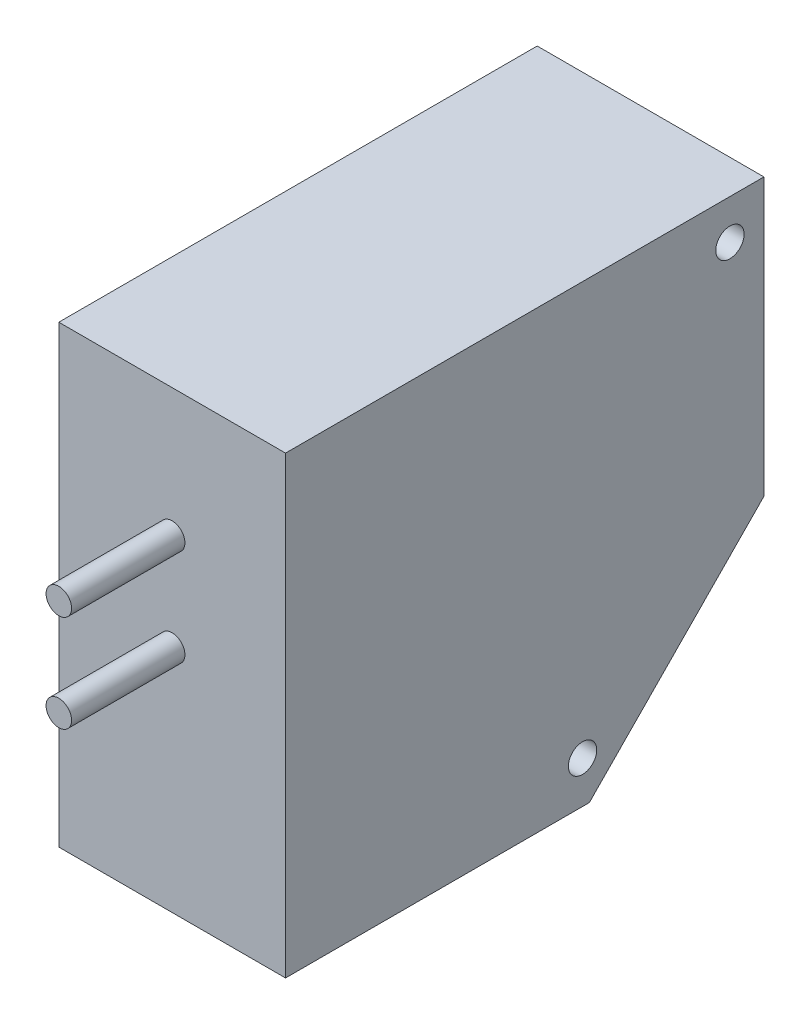
ISO-10303-21;
HEADER;
FILE_DESCRIPTION(('STEP AP214'),'2;1');
FILE_NAME('part.step','',(''),(''),'','','');
FILE_SCHEMA(('AUTOMOTIVE_DESIGN { 1 0 10303 214 1 1 1 1 }'));
ENDSEC;
DATA;
#1=APPLICATION_CONTEXT('core data for automotive mechanical design processes');
#2=APPLICATION_PROTOCOL_DEFINITION('international standard','automotive_design',2000,#1);
#3=PRODUCT_CONTEXT('',#1,'mechanical');
#4=PRODUCT('Part','Part','',(#3));
#5=PRODUCT_RELATED_PRODUCT_CATEGORY('part','',(#4));
#6=PRODUCT_DEFINITION_FORMATION('','',#4);
#7=PRODUCT_DEFINITION_CONTEXT('part definition',#1,'design');
#8=PRODUCT_DEFINITION('design','',#6,#7);
#9=PRODUCT_DEFINITION_SHAPE('','',#8);
#10=(LENGTH_UNIT() NAMED_UNIT(*) SI_UNIT(.MILLI.,.METRE.));
#11=(NAMED_UNIT(*) PLANE_ANGLE_UNIT() SI_UNIT($,.RADIAN.));
#12=(NAMED_UNIT(*) SI_UNIT($,.STERADIAN.) SOLID_ANGLE_UNIT());
#13=UNCERTAINTY_MEASURE_WITH_UNIT(LENGTH_MEASURE(1.E-05),#10,'distance_accuracy_value','');
#14=(GEOMETRIC_REPRESENTATION_CONTEXT(3) GLOBAL_UNCERTAINTY_ASSIGNED_CONTEXT((#13)) GLOBAL_UNIT_ASSIGNED_CONTEXT((#10,
#11,#12)) REPRESENTATION_CONTEXT('',''));
#15=CARTESIAN_POINT('',(0.,0.,0.));
#16=DIRECTION('',(0.,0.,1.));
#17=DIRECTION('',(1.,0.,0.));
#18=AXIS2_PLACEMENT_3D('',#15,#16,#17);
#19=CARTESIAN_POINT('',(20.,20.05,21.1));
#20=DIRECTION('',(0.,0.,-1.));
#21=DIRECTION('',(0.,1.,0.));
#22=AXIS2_PLACEMENT_3D('',#19,#20,#21);
#23=PLANE('',#22);
#24=CARTESIAN_POINT('',(10.,8.75000000000001,21.1));
#25=DIRECTION('',(0.,0.,-1.));
#26=DIRECTION('',(0.,1.,0.));
#27=AXIS2_PLACEMENT_3D('',#24,#25,#26);
#28=CIRCLE('',#27,1.125);
#29=CARTESIAN_POINT('',(10.,9.87500000000001,21.1));
#30=VERTEX_POINT('',#29);
#31=EDGE_CURVE('E41',#30,#30,#28,.F.);
#32=ORIENTED_EDGE('',*,*,#31,.F.);
#33=EDGE_LOOP('',(#32));
#34=FACE_BOUND('',#33,.T.);
#35=DIRECTION('',(0.,-1.,0.));
#36=VECTOR('',#35,1.);
#37=CARTESIAN_POINT('',(0.,20.05,21.1));
#38=LINE('',#37,#36);
#39=CARTESIAN_POINT('',(0.,20.05,21.1));
#40=VERTEX_POINT('',#39);
#41=CARTESIAN_POINT('',(0.,-20.05,21.1));
#42=VERTEX_POINT('',#41);
#43=EDGE_CURVE('E109',#40,#42,#38,.T.);
#44=ORIENTED_EDGE('',*,*,#43,.T.);
#45=DIRECTION('',(-1.,0.,0.));
#46=VECTOR('',#45,1.);
#47=CARTESIAN_POINT('',(20.,-20.05,21.1));
#48=LINE('',#47,#46);
#49=CARTESIAN_POINT('',(20.,-20.05,21.1));
#50=VERTEX_POINT('',#49);
#51=EDGE_CURVE('E122',#50,#42,#48,.T.);
#52=ORIENTED_EDGE('',*,*,#51,.F.);
#53=DIRECTION('',(0.,-1.,0.));
#54=VECTOR('',#53,1.);
#55=CARTESIAN_POINT('',(20.,20.05,21.1));
#56=LINE('',#55,#54);
#57=CARTESIAN_POINT('',(20.,20.05,21.1));
#58=VERTEX_POINT('',#57);
#59=EDGE_CURVE('E118',#58,#50,#56,.T.);
#60=ORIENTED_EDGE('',*,*,#59,.F.);
#61=DIRECTION('',(-1.,0.,0.));
#62=VECTOR('',#61,1.);
#63=CARTESIAN_POINT('',(20.,20.05,21.1));
#64=LINE('',#63,#62);
#65=EDGE_CURVE('E105',#58,#40,#64,.T.);
#66=ORIENTED_EDGE('',*,*,#65,.T.);
#67=EDGE_LOOP('',(#44,#52,#60,#66));
#68=FACE_BOUND('',#67,.T.);
#69=CARTESIAN_POINT('',(10.,0.200000000000006,21.1));
#70=DIRECTION('',(0.,0.,-1.));
#71=DIRECTION('',(0.,1.,0.));
#72=AXIS2_PLACEMENT_3D('',#69,#70,#71);
#73=CIRCLE('',#72,1.125);
#74=CARTESIAN_POINT('',(10.,1.32500000000001,21.1));
#75=VERTEX_POINT('',#74);
#76=EDGE_CURVE('E11',#75,#75,#73,.F.);
#77=ORIENTED_EDGE('',*,*,#76,.F.);
#78=EDGE_LOOP('',(#77));
#79=FACE_BOUND('',#78,.T.);
#80=ADVANCED_FACE('F33',(#34,#68,#79),#23,.F.);
#81=CARTESIAN_POINT('',(20.,-20.05,21.1));
#82=DIRECTION('',(0.,1.,0.));
#83=DIRECTION('',(0.,0.,1.));
#84=AXIS2_PLACEMENT_3D('',#81,#82,#83);
#85=PLANE('',#84);
#86=DIRECTION('',(0.,0.,-1.));
#87=VECTOR('',#86,1.);
#88=CARTESIAN_POINT('',(0.,-20.05,21.1));
#89=LINE('',#88,#87);
#90=CARTESIAN_POINT('',(0.,-20.05,-5.7));
#91=VERTEX_POINT('',#90);
#92=EDGE_CURVE('E112',#42,#91,#89,.T.);
#93=ORIENTED_EDGE('',*,*,#92,.T.);
#94=DIRECTION('',(-1.,0.,0.));
#95=VECTOR('',#94,1.);
#96=CARTESIAN_POINT('',(20.,-20.05,-5.7));
#97=LINE('',#96,#95);
#98=CARTESIAN_POINT('',(20.,-20.05,-5.7));
#99=VERTEX_POINT('',#98);
#100=EDGE_CURVE('E100',#99,#91,#97,.T.);
#101=ORIENTED_EDGE('',*,*,#100,.F.);
#102=DIRECTION('',(0.,0.,-1.));
#103=VECTOR('',#102,1.);
#104=CARTESIAN_POINT('',(20.,-20.05,21.1));
#105=LINE('',#104,#103);
#106=EDGE_CURVE('E84',#50,#99,#105,.T.);
#107=ORIENTED_EDGE('',*,*,#106,.F.);
#108=ORIENTED_EDGE('',*,*,#51,.T.);
#109=EDGE_LOOP('',(#93,#101,#107,#108));
#110=FACE_BOUND('',#109,.T.);
#111=ADVANCED_FACE('F130',(#110),#85,.F.);
#112=CARTESIAN_POINT('',(20.,-20.05,-5.7));
#113=DIRECTION('',(0.,0.700253236526023,0.713894533341466));
#114=DIRECTION('',(0.,-0.713894533341466,0.700253236526023));
#115=AXIS2_PLACEMENT_3D('',#112,#113,#114);
#116=PLANE('',#115);
#117=DIRECTION('',(0.,0.713894533341466,-0.700253236526023));
#118=VECTOR('',#117,1.);
#119=CARTESIAN_POINT('',(0.,-20.05,-5.7));
#120=LINE('',#119,#118);
#121=CARTESIAN_POINT('',(0.,-4.34999999999999,-21.1));
#122=VERTEX_POINT('',#121);
#123=EDGE_CURVE('E99',#91,#122,#120,.T.);
#124=ORIENTED_EDGE('',*,*,#123,.T.);
#125=DIRECTION('',(-1.,0.,0.));
#126=VECTOR('',#125,1.);
#127=CARTESIAN_POINT('',(20.,-4.34999999999999,-21.1));
#128=LINE('',#127,#126);
#129=CARTESIAN_POINT('',(20.,-4.34999999999999,-21.1));
#130=VERTEX_POINT('',#129);
#131=EDGE_CURVE('E96',#130,#122,#128,.T.);
#132=ORIENTED_EDGE('',*,*,#131,.F.);
#133=DIRECTION('',(0.,0.713894533341466,-0.700253236526023));
#134=VECTOR('',#133,1.);
#135=CARTESIAN_POINT('',(20.,-20.05,-5.7));
#136=LINE('',#135,#134);
#137=EDGE_CURVE('E88',#99,#130,#136,.T.);
#138=ORIENTED_EDGE('',*,*,#137,.F.);
#139=ORIENTED_EDGE('',*,*,#100,.T.);
#140=EDGE_LOOP('',(#124,#132,#138,#139));
#141=FACE_BOUND('',#140,.T.);
#142=ADVANCED_FACE('F97',(#141),#116,.F.);
#143=CARTESIAN_POINT('',(20.,20.05,-21.1));
#144=DIRECTION('',(0.,0.,1.));
#145=DIRECTION('',(1.,0.,0.));
#146=AXIS2_PLACEMENT_3D('',#143,#144,#145);
#147=PLANE('',#146);
#148=DIRECTION('',(0.,1.,0.));
#149=VECTOR('',#148,1.);
#150=CARTESIAN_POINT('',(0.,20.05,-21.1));
#151=LINE('',#150,#149);
#152=CARTESIAN_POINT('',(0.,20.05,-21.1));
#153=VERTEX_POINT('',#152);
#154=EDGE_CURVE('E69',#122,#153,#151,.T.);
#155=ORIENTED_EDGE('',*,*,#154,.T.);
#156=DIRECTION('',(-1.,0.,0.));
#157=VECTOR('',#156,1.);
#158=CARTESIAN_POINT('',(20.,20.05,-21.1));
#159=LINE('',#158,#157);
#160=CARTESIAN_POINT('',(20.,20.05,-21.1));
#161=VERTEX_POINT('',#160);
#162=EDGE_CURVE('E101',#161,#153,#159,.T.);
#163=ORIENTED_EDGE('',*,*,#162,.F.);
#164=DIRECTION('',(0.,1.,0.));
#165=VECTOR('',#164,1.);
#166=CARTESIAN_POINT('',(20.,20.05,-21.1));
#167=LINE('',#166,#165);
#168=EDGE_CURVE('E92',#130,#161,#167,.T.);
#169=ORIENTED_EDGE('',*,*,#168,.F.);
#170=ORIENTED_EDGE('',*,*,#131,.T.);
#171=EDGE_LOOP('',(#155,#163,#169,#170));
#172=FACE_BOUND('',#171,.T.);
#173=ADVANCED_FACE('F103',(#172),#147,.F.);
#174=CARTESIAN_POINT('',(20.,20.05,21.1));
#175=DIRECTION('',(0.,-1.,0.));
#176=DIRECTION('',(0.,0.,-1.));
#177=AXIS2_PLACEMENT_3D('',#174,#175,#176);
#178=PLANE('',#177);
#179=DIRECTION('',(0.,0.,1.));
#180=VECTOR('',#179,1.);
#181=CARTESIAN_POINT('',(0.,20.05,21.1));
#182=LINE('',#181,#180);
#183=EDGE_CURVE('E75',#153,#40,#182,.T.);
#184=ORIENTED_EDGE('',*,*,#183,.T.);
#185=ORIENTED_EDGE('',*,*,#65,.F.);
#186=DIRECTION('',(0.,0.,1.));
#187=VECTOR('',#186,1.);
#188=CARTESIAN_POINT('',(20.,20.05,21.1));
#189=LINE('',#188,#187);
#190=EDGE_CURVE('E49',#161,#58,#189,.T.);
#191=ORIENTED_EDGE('',*,*,#190,.F.);
#192=ORIENTED_EDGE('',*,*,#162,.T.);
#193=EDGE_LOOP('',(#184,#185,#191,#192));
#194=FACE_BOUND('',#193,.T.);
#195=ADVANCED_FACE('F166',(#194),#178,.F.);
#196=CARTESIAN_POINT('',(20.,-20.05,21.1));
#197=DIRECTION('',(1.,0.,0.));
#198=DIRECTION('',(0.,0.,-1.));
#199=AXIS2_PLACEMENT_3D('',#196,#197,#198);
#200=PLANE('',#199);
#201=CARTESIAN_POINT('',(20.,-16.35,-5.09999999999999));
#202=DIRECTION('',(1.,0.,0.));
#203=DIRECTION('',(0.,0.,-1.));
#204=AXIS2_PLACEMENT_3D('',#201,#202,#203);
#205=CIRCLE('',#204,1.24999999999999);
#206=CARTESIAN_POINT('',(20.,-16.35,-6.34999999999998));
#207=VERTEX_POINT('',#206);
#208=EDGE_CURVE('E191',#207,#207,#205,.T.);
#209=ORIENTED_EDGE('',*,*,#208,.F.);
#210=EDGE_LOOP('',(#209));
#211=FACE_BOUND('',#210,.T.);
#212=CARTESIAN_POINT('',(20.,16.55,-18.1));
#213=DIRECTION('',(1.,0.,0.));
#214=DIRECTION('',(0.,0.,-1.));
#215=AXIS2_PLACEMENT_3D('',#212,#213,#214);
#216=CIRCLE('',#215,1.24999999999999);
#217=CARTESIAN_POINT('',(20.,16.55,-19.35));
#218=VERTEX_POINT('',#217);
#219=EDGE_CURVE('E185',#218,#218,#216,.T.);
#220=ORIENTED_EDGE('',*,*,#219,.F.);
#221=EDGE_LOOP('',(#220));
#222=FACE_BOUND('',#221,.T.);
#223=ORIENTED_EDGE('',*,*,#59,.T.);
#224=ORIENTED_EDGE('',*,*,#106,.T.);
#225=ORIENTED_EDGE('',*,*,#137,.T.);
#226=ORIENTED_EDGE('',*,*,#168,.T.);
#227=ORIENTED_EDGE('',*,*,#190,.T.);
#228=EDGE_LOOP('',(#223,#224,#225,#226,#227));
#229=FACE_BOUND('',#228,.T.);
#230=ADVANCED_FACE('F90',(#211,#222,#229),#200,.T.);
#231=CARTESIAN_POINT('',(0.,-20.05,21.1));
#232=DIRECTION('',(1.,0.,0.));
#233=DIRECTION('',(0.,0.,-1.));
#234=AXIS2_PLACEMENT_3D('',#231,#232,#233);
#235=PLANE('',#234);
#236=CARTESIAN_POINT('',(0.,-16.35,-5.09999999999999));
#237=DIRECTION('',(1.,0.,0.));
#238=DIRECTION('',(0.,0.,-1.));
#239=AXIS2_PLACEMENT_3D('',#236,#237,#238);
#240=CIRCLE('',#239,1.24999999999999);
#241=CARTESIAN_POINT('',(0.,-16.35,-6.34999999999999));
#242=VERTEX_POINT('',#241);
#243=EDGE_CURVE('E188',#242,#242,#240,.T.);
#244=ORIENTED_EDGE('',*,*,#243,.T.);
#245=EDGE_LOOP('',(#244));
#246=FACE_BOUND('',#245,.T.);
#247=CARTESIAN_POINT('',(0.,16.55,-18.1));
#248=DIRECTION('',(1.,0.,0.));
#249=DIRECTION('',(0.,0.,-1.));
#250=AXIS2_PLACEMENT_3D('',#247,#248,#249);
#251=CIRCLE('',#250,1.24999999999999);
#252=CARTESIAN_POINT('',(0.,16.55,-19.35));
#253=VERTEX_POINT('',#252);
#254=EDGE_CURVE('E113',#253,#253,#251,.T.);
#255=ORIENTED_EDGE('',*,*,#254,.T.);
#256=EDGE_LOOP('',(#255));
#257=FACE_BOUND('',#256,.T.);
#258=ORIENTED_EDGE('',*,*,#43,.F.);
#259=ORIENTED_EDGE('',*,*,#183,.F.);
#260=ORIENTED_EDGE('',*,*,#154,.F.);
#261=ORIENTED_EDGE('',*,*,#123,.F.);
#262=ORIENTED_EDGE('',*,*,#92,.F.);
#263=EDGE_LOOP('',(#258,#259,#260,#261,#262));
#264=FACE_BOUND('',#263,.T.);
#265=ADVANCED_FACE('F162',(#246,#257,#264),#235,.F.);
#266=CARTESIAN_POINT('',(20.,16.55,-18.1));
#267=DIRECTION('',(1.,0.,0.));
#268=DIRECTION('',(0.,0.,-1.));
#269=AXIS2_PLACEMENT_3D('',#266,#267,#268);
#270=CYLINDRICAL_SURFACE('',#269,1.24999999999999);
#271=ORIENTED_EDGE('',*,*,#254,.F.);
#272=EDGE_LOOP('',(#271));
#273=FACE_BOUND('',#272,.T.);
#274=ORIENTED_EDGE('',*,*,#219,.T.);
#275=EDGE_LOOP('',(#274));
#276=FACE_BOUND('',#275,.T.);
#277=ADVANCED_FACE('F158',(#273,#276),#270,.F.);
#278=CARTESIAN_POINT('',(20.,-16.35,-5.09999999999999));
#279=DIRECTION('',(1.,0.,0.));
#280=DIRECTION('',(0.,0.,-1.));
#281=AXIS2_PLACEMENT_3D('',#278,#279,#280);
#282=CYLINDRICAL_SURFACE('',#281,1.24999999999999);
#283=ORIENTED_EDGE('',*,*,#243,.F.);
#284=EDGE_LOOP('',(#283));
#285=FACE_BOUND('',#284,.T.);
#286=ORIENTED_EDGE('',*,*,#208,.T.);
#287=EDGE_LOOP('',(#286));
#288=FACE_BOUND('',#287,.T.);
#289=ADVANCED_FACE('F154',(#285,#288),#282,.F.);
#290=CARTESIAN_POINT('',(10.,8.75000000000001,31.1));
#291=DIRECTION('',(0.,0.,-1.));
#292=DIRECTION('',(-1.,0.,0.));
#293=AXIS2_PLACEMENT_3D('',#290,#291,#292);
#294=CYLINDRICAL_SURFACE('',#293,1.125);
#295=CARTESIAN_POINT('',(10.,8.75000000000001,31.1));
#296=DIRECTION('',(0.,0.,1.));
#297=DIRECTION('',(1.,0.,0.));
#298=AXIS2_PLACEMENT_3D('',#295,#296,#297);
#299=CIRCLE('',#298,1.125);
#300=CARTESIAN_POINT('',(11.125,8.75000000000001,31.1));
#301=VERTEX_POINT('',#300);
#302=EDGE_CURVE('E194',#301,#301,#299,.T.);
#303=ORIENTED_EDGE('',*,*,#302,.F.);
#304=EDGE_LOOP('',(#303));
#305=FACE_BOUND('',#304,.T.);
#306=ORIENTED_EDGE('',*,*,#31,.T.);
#307=EDGE_LOOP('',(#306));
#308=FACE_BOUND('',#307,.T.);
#309=ADVANCED_FACE('F126',(#305,#308),#294,.T.);
#310=CARTESIAN_POINT('',(10.,8.75000000000001,31.1));
#311=DIRECTION('',(0.,0.,1.));
#312=DIRECTION('',(1.,0.,0.));
#313=AXIS2_PLACEMENT_3D('',#310,#311,#312);
#314=PLANE('',#313);
#315=ORIENTED_EDGE('',*,*,#302,.T.);
#316=EDGE_LOOP('',(#315));
#317=FACE_BOUND('',#316,.T.);
#318=ADVANCED_FACE('F139',(#317),#314,.T.);
#319=CARTESIAN_POINT('',(10.,0.200000000000006,31.1));
#320=DIRECTION('',(0.,0.,-1.));
#321=DIRECTION('',(-1.,0.,0.));
#322=AXIS2_PLACEMENT_3D('',#319,#320,#321);
#323=CYLINDRICAL_SURFACE('',#322,1.125);
#324=CARTESIAN_POINT('',(10.,0.200000000000006,31.1));
#325=DIRECTION('',(0.,0.,1.));
#326=DIRECTION('',(1.,0.,0.));
#327=AXIS2_PLACEMENT_3D('',#324,#325,#326);
#328=CIRCLE('',#327,1.125);
#329=CARTESIAN_POINT('',(11.125,0.200000000000006,31.1));
#330=VERTEX_POINT('',#329);
#331=EDGE_CURVE('E197',#330,#330,#328,.T.);
#332=ORIENTED_EDGE('',*,*,#331,.F.);
#333=EDGE_LOOP('',(#332));
#334=FACE_BOUND('',#333,.T.);
#335=ORIENTED_EDGE('',*,*,#76,.T.);
#336=EDGE_LOOP('',(#335));
#337=FACE_BOUND('',#336,.T.);
#338=ADVANCED_FACE('F136',(#334,#337),#323,.T.);
#339=CARTESIAN_POINT('',(10.,0.200000000000006,31.1));
#340=DIRECTION('',(0.,0.,1.));
#341=DIRECTION('',(1.,0.,0.));
#342=AXIS2_PLACEMENT_3D('',#339,#340,#341);
#343=PLANE('',#342);
#344=ORIENTED_EDGE('',*,*,#331,.T.);
#345=EDGE_LOOP('',(#344));
#346=FACE_BOUND('',#345,.T.);
#347=ADVANCED_FACE('F138',(#346),#343,.T.);
#348=CLOSED_SHELL('',(#80,#111,#142,#173,#195,#230,#265,#277,#289,#309,#318,#338,#347));
#349=MANIFOLD_SOLID_BREP('B2',#348);
#350=ADVANCED_BREP_SHAPE_REPRESENTATION('',(#18,#349),#14);
#351=SHAPE_DEFINITION_REPRESENTATION(#9,#350);
ENDSEC;
END-ISO-10303-21;
